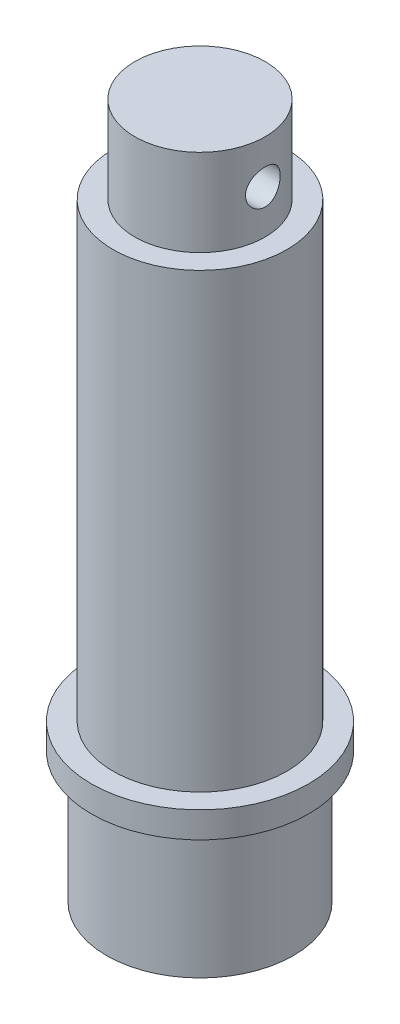
ISO-10303-21;
HEADER;
FILE_DESCRIPTION(('STEP AP214'),'2;1');
FILE_NAME('part.step','',(''),(''),'','','');
FILE_SCHEMA(('AUTOMOTIVE_DESIGN { 1 0 10303 214 1 1 1 1 }'));
ENDSEC;
DATA;
#1=APPLICATION_CONTEXT('core data for automotive mechanical design processes');
#2=APPLICATION_PROTOCOL_DEFINITION('international standard','automotive_design',2000,#1);
#3=PRODUCT_CONTEXT('',#1,'mechanical');
#4=PRODUCT('Part','Part','',(#3));
#5=PRODUCT_RELATED_PRODUCT_CATEGORY('part','',(#4));
#6=PRODUCT_DEFINITION_FORMATION('','',#4);
#7=PRODUCT_DEFINITION_CONTEXT('part definition',#1,'design');
#8=PRODUCT_DEFINITION('design','',#6,#7);
#9=PRODUCT_DEFINITION_SHAPE('','',#8);
#10=(LENGTH_UNIT() NAMED_UNIT(*) SI_UNIT(.MILLI.,.METRE.));
#11=(NAMED_UNIT(*) PLANE_ANGLE_UNIT() SI_UNIT($,.RADIAN.));
#12=(NAMED_UNIT(*) SI_UNIT($,.STERADIAN.) SOLID_ANGLE_UNIT());
#13=UNCERTAINTY_MEASURE_WITH_UNIT(LENGTH_MEASURE(1.E-05),#10,'distance_accuracy_value','');
#14=(GEOMETRIC_REPRESENTATION_CONTEXT(3) GLOBAL_UNCERTAINTY_ASSIGNED_CONTEXT((#13)) GLOBAL_UNIT_ASSIGNED_CONTEXT((#10,
#11,#12)) REPRESENTATION_CONTEXT('',''));
#15=CARTESIAN_POINT('',(0.,0.,0.));
#16=DIRECTION('',(0.,0.,1.));
#17=DIRECTION('',(1.,0.,0.));
#18=AXIS2_PLACEMENT_3D('',#15,#16,#17);
#19=CARTESIAN_POINT('',(-1.56472057533108E-13,54.9999999999999,0.));
#20=DIRECTION('',(0.,-1.,0.));
#21=DIRECTION('',(1.,0.,0.));
#22=AXIS2_PLACEMENT_3D('',#19,#20,#21);
#23=CYLINDRICAL_SURFACE('',#22,10.);
#24=CARTESIAN_POINT('',(0.,-7.00000000000007,0.));
#25=DIRECTION('',(0.,1.,0.));
#26=DIRECTION('',(-1.,0.,0.));
#27=AXIS2_PLACEMENT_3D('',#24,#25,#26);
#28=CIRCLE('',#27,10.);
#29=CARTESIAN_POINT('',(-9.99999999999998,-7.0000000000001,0.));
#30=VERTEX_POINT('',#29);
#31=EDGE_CURVE('E52',#30,#30,#28,.T.);
#32=ORIENTED_EDGE('',*,*,#31,.T.);
#33=EDGE_LOOP('',(#32));
#34=FACE_BOUND('',#33,.T.);
#35=CARTESIAN_POINT('',(-1.28022592527089E-13,45.,0.));
#36=DIRECTION('',(0.,1.,0.));
#37=DIRECTION('',(-1.,0.,0.));
#38=AXIS2_PLACEMENT_3D('',#35,#36,#37);
#39=CIRCLE('',#38,10.);
#40=CARTESIAN_POINT('',(-10.0000000000001,44.9999999999999,0.));
#41=VERTEX_POINT('',#40);
#42=EDGE_CURVE('E11',#41,#41,#39,.T.);
#43=ORIENTED_EDGE('',*,*,#42,.F.);
#44=EDGE_LOOP('',(#43));
#45=FACE_BOUND('',#44,.T.);
#46=ADVANCED_FACE('F48',(#34,#45),#23,.T.);
#47=CARTESIAN_POINT('',(-1.28022592527089E-13,45.,0.));
#48=DIRECTION('',(0.,1.,0.));
#49=DIRECTION('',(-1.,0.,0.));
#50=AXIS2_PLACEMENT_3D('',#47,#48,#49);
#51=CYLINDRICAL_SURFACE('',#50,7.5);
#52=CARTESIAN_POINT('',(7.22841614740034,50.,2.));
#53=CARTESIAN_POINT('',(7.22841805697237,50.1101759377402,1.99999734315871));
#54=CARTESIAN_POINT('',(7.23096264549659,50.220380000476,1.99086493224743));
#55=CARTESIAN_POINT('',(7.24083561155082,50.4376054215563,1.95464583260237));
#56=CARTESIAN_POINT('',(7.24816638907919,50.544625154978,1.92755013620952));
#57=CARTESIAN_POINT('',(7.26672375176824,50.7523080699467,1.85635845560073));
#58=CARTESIAN_POINT('',(7.27794485684189,50.8529799588284,1.81228637542178));
#59=CARTESIAN_POINT('',(7.30301154920387,51.0455167400598,1.70846784563704));
#60=CARTESIAN_POINT('',(7.31685734034409,51.1373809475069,1.6487201784145));
#61=CARTESIAN_POINT('',(7.34600139553452,51.3119925469877,1.51364847874559));
#62=CARTESIAN_POINT('',(7.36132541116428,51.3944870174644,1.43800297504208));
#63=CARTESIAN_POINT('',(7.39147701436492,51.5457815769511,1.27397427284021));
#64=CARTESIAN_POINT('',(7.40630455033424,51.6145802461417,1.18558975534664));
#65=CARTESIAN_POINT('',(7.43407988468404,51.7375849384029,0.996838170873268));
#66=CARTESIAN_POINT('',(7.44699376262278,51.7915395186328,0.896301819879479));
#67=CARTESIAN_POINT('',(7.46919126211819,51.8816846353672,0.68718304472909));
#68=CARTESIAN_POINT('',(7.47847549576247,51.9178781672815,0.578601980875103));
#69=CARTESIAN_POINT('',(7.49218553576447,51.9706552202357,0.359115961810089));
#70=CARTESIAN_POINT('',(7.4967177675025,51.9876689766259,0.248321224200915));
#71=CARTESIAN_POINT('',(7.50078524617735,52.0029571201071,0.025363553508575));
#72=CARTESIAN_POINT('',(7.50032132946593,52.0012346436301,-0.0867991474385301));
#73=CARTESIAN_POINT('',(7.4945267585975,51.9794021874605,-0.306314237111347));
#74=CARTESIAN_POINT('',(7.48931914026984,51.9597570423637,-0.413716600721112));
#75=CARTESIAN_POINT('',(7.47476748590455,51.903387862218,-0.623641315571057));
#76=CARTESIAN_POINT('',(7.46542321400575,51.8666628533139,-0.726163388180582));
#77=CARTESIAN_POINT('',(7.44346569099877,51.7768201524076,-0.924603945147555));
#78=CARTESIAN_POINT('',(7.43082087877657,51.7235431928992,-1.02044668632954));
#79=CARTESIAN_POINT('',(7.40362468509489,51.6022311804909,-1.20198999876452));
#80=CARTESIAN_POINT('',(7.38907293222985,51.5341932509718,-1.28768858808586));
#81=CARTESIAN_POINT('',(7.35911272938704,51.382823142066,-1.44928536946561));
#82=CARTESIAN_POINT('',(7.34369169368724,51.2990855549506,-1.52480192017773));
#83=CARTESIAN_POINT('',(7.31413405023506,51.1199753237611,-1.66081332104769));
#84=CARTESIAN_POINT('',(7.29999752083051,51.0246019707995,-1.72130725529808));
#85=CARTESIAN_POINT('',(7.27455902280762,50.8240998981786,-1.82584679186274));
#86=CARTESIAN_POINT('',(7.26327507092141,50.7189146490868,-1.86978866600526));
#87=CARTESIAN_POINT('',(7.24504325087501,50.502273500545,-1.93924001685674));
#88=CARTESIAN_POINT('',(7.23809430746831,50.3908191635496,-1.96475406461341));
#89=CARTESIAN_POINT('',(7.22954835612961,50.1683727889716,-1.99596757092855));
#90=CARTESIAN_POINT('',(7.22779763213442,50.0574664513786,-2.00223632621177));
#91=CARTESIAN_POINT('',(7.22942578390801,49.8361902271914,-1.9963498112297));
#92=CARTESIAN_POINT('',(7.23280411376424,49.72582028476,-1.98419650172322));
#93=CARTESIAN_POINT('',(7.24416124318851,49.5109434059084,-1.94231271869971));
#94=CARTESIAN_POINT('',(7.25205039699285,49.4063645620627,-1.91292447912922));
#95=CARTESIAN_POINT('',(7.2714526895277,49.20362036864,-1.83778986725474));
#96=CARTESIAN_POINT('',(7.28296630148549,49.1054558585725,-1.79204135876651));
#97=CARTESIAN_POINT('',(7.3086357247297,48.9159450425647,-1.68432905508707));
#98=CARTESIAN_POINT('',(7.3228440487285,48.8247960241102,-1.62203095237924));
#99=CARTESIAN_POINT('',(7.35217841933652,48.6540366982968,-1.48340227987515));
#100=CARTESIAN_POINT('',(7.36730463810224,48.5744285650458,-1.40706907222966));
#101=CARTESIAN_POINT('',(7.39729964884442,48.42664752675,-1.23990378250484));
#102=CARTESIAN_POINT('',(7.41214836523835,48.3588716230214,-1.14871641600884));
#103=CARTESIAN_POINT('',(7.43946670017113,48.2395890125894,-0.955928435940741));
#104=CARTESIAN_POINT('',(7.45193644532891,48.188081439921,-0.854328377018883));
#105=CARTESIAN_POINT('',(7.47301150899247,48.1032703676384,-0.644314134825873));
#106=CARTESIAN_POINT('',(7.48164558480371,48.0698309805565,-0.535957852882338));
#107=CARTESIAN_POINT('',(7.49420303787233,48.0217112719356,-0.31489938473132));
#108=CARTESIAN_POINT('',(7.49812745904966,48.0070267932253,-0.202198167320242));
#109=CARTESIAN_POINT('',(7.50077413437678,47.9970941762585,0.0206420013461514));
#110=CARTESIAN_POINT('',(7.49965226288069,48.0012636808688,0.130753511527865));
#111=CARTESIAN_POINT('',(7.49268490978846,48.0275684935752,0.348648304630718));
#112=CARTESIAN_POINT('',(7.48683960554772,48.049703127117,0.456431674812815));
#113=CARTESIAN_POINT('',(7.47111310390909,48.1109806049185,0.66591012346421));
#114=CARTESIAN_POINT('',(7.46125997189216,48.1500052934724,0.767642011851539));
#115=CARTESIAN_POINT('',(7.4385481651648,48.2438496017462,0.963172098471352));
#116=CARTESIAN_POINT('',(7.42568906899239,48.2986714366128,1.05696918166215));
#117=CARTESIAN_POINT('',(7.39791331224108,48.424258272137,1.23667826867367));
#118=CARTESIAN_POINT('',(7.38295093371621,48.4954093806986,1.32231336173331));
#119=CARTESIAN_POINT('',(7.35284000077242,48.6509027493649,1.48062537156133));
#120=CARTESIAN_POINT('',(7.33769139839707,48.7352484758193,1.55329887243048));
#121=CARTESIAN_POINT('',(7.30853959638842,48.9169683958175,1.68520700232561));
#122=CARTESIAN_POINT('',(7.29456891224632,49.0145883136572,1.74411094261233));
#123=CARTESIAN_POINT('',(7.26981393903458,49.2187063108602,1.84458689030054));
#124=CARTESIAN_POINT('',(7.25902756724933,49.3251985285394,1.88617023367332));
#125=CARTESIAN_POINT('',(7.2433600065386,49.5260813360512,1.94538124252481));
#126=CARTESIAN_POINT('',(7.23780140272181,49.6196012645567,1.96581518399489));
#127=CARTESIAN_POINT('',(7.23032885211556,49.8087405579939,1.9931249429388));
#128=CARTESIAN_POINT('',(7.22841448976002,49.9043596822888,2.0000023063216));
#129=CARTESIAN_POINT('',(7.22841614740034,50.,2.));
#130=B_SPLINE_CURVE_WITH_KNOTS('',3,(#52,#53,#54,#55,#56,#57,#58,#59,#60,#61,#62,#63,#64,#65,
#66,#67,#68,#69,#70,#71,#72,#73,#74,#75,#76,#77,#78,#79,#80,#81,#82,#83,#84,#85,#86,#87,#88,#89,
#90,#91,#92,#93,#94,#95,#96,#97,#98,#99,#100,#101,#102,#103,#104,#105,#106,#107,#108,#109,#110,
#111,#112,#113,#114,#115,#116,#117,#118,#119,#120,#121,#122,#123,#124,#125,#126,#127,#128,#129),
.UNSPECIFIED.,.T.,.F.,(4,2,2,2,2,2,2,2,2,2,2,2,2,2,2,2,2,2,2,2,2,2,2,2,2,2,2,2,2,2,2,2,2,2,2,2,
2,2,4),(0.,0.33017612811603,0.660517947850204,0.99039631159616,1.32030030656104,
1.65765916130211,1.99505297124461,2.33785207370803,2.68059334304246,3.0154830431648,
3.35031668385603,3.67670570800803,4.00311334440696,4.3327644890557,4.66247993394491,
5.00231762300329,5.34217602639579,5.68413015096536,6.02599942418508,6.35765334242024,
6.68927196343503,7.01451850432575,7.33980752864823,7.67224634967772,8.00474771541475,
8.34685906959633,8.68895221008103,9.02843539591401,9.36784331959006,9.69684054916463,
10.0258254261296,10.3525451486866,10.6793107076596,11.0147885399158,11.3503546538105,
11.6933003898558,12.0360213210131,12.3226696767153,12.6092853429065),.UNSPECIFIED.);
#131=CARTESIAN_POINT('',(7.22841614740034,50.,2.));
#132=VERTEX_POINT('',#131);
#133=EDGE_CURVE('E65',#132,#132,#130,.T.);
#134=ORIENTED_EDGE('',*,*,#133,.T.);
#135=EDGE_LOOP('',(#134));
#136=FACE_BOUND('',#135,.T.);
#137=CARTESIAN_POINT('',(-1.28022592527089E-13,45.,0.));
#138=DIRECTION('',(0.,1.,0.));
#139=DIRECTION('',(-1.,0.,0.));
#140=AXIS2_PLACEMENT_3D('',#137,#138,#139);
#141=CIRCLE('',#140,7.5);
#142=CARTESIAN_POINT('',(-7.50000000000013,44.9999999999999,0.));
#143=VERTEX_POINT('',#142);
#144=EDGE_CURVE('E56',#143,#143,#141,.T.);
#145=ORIENTED_EDGE('',*,*,#144,.T.);
#146=EDGE_LOOP('',(#145));
#147=FACE_BOUND('',#146,.T.);
#148=CARTESIAN_POINT('',(-1.56472057533108E-13,54.9999999999999,0.));
#149=DIRECTION('',(0.,1.,0.));
#150=DIRECTION('',(-1.,0.,0.));
#151=AXIS2_PLACEMENT_3D('',#148,#149,#150);
#152=CIRCLE('',#151,7.5);
#153=CARTESIAN_POINT('',(-7.50000000000016,54.9999999999999,0.));
#154=VERTEX_POINT('',#153);
#155=EDGE_CURVE('E61',#154,#154,#152,.T.);
#156=ORIENTED_EDGE('',*,*,#155,.F.);
#157=EDGE_LOOP('',(#156));
#158=FACE_BOUND('',#157,.T.);
#159=CARTESIAN_POINT('',(-7.50000000000014,47.9999999999999,0.));
#160=CARTESIAN_POINT('',(-7.49999833810175,48.0000026169348,-0.110254555832854));
#161=CARTESIAN_POINT('',(-7.49754486162164,48.0091476141896,-0.22053716022184));
#162=CARTESIAN_POINT('',(-7.48799573621673,48.0454212307386,-0.437925451354464));
#163=CARTESIAN_POINT('',(-7.480897853326,48.0725585044261,-0.545029583319087));
#164=CARTESIAN_POINT('',(-7.46284333252804,48.143871666864,-0.752891589045312));
#165=CARTESIAN_POINT('',(-7.45189167130389,48.188025587666,-0.853657451015282));
#166=CARTESIAN_POINT('',(-7.42728699151692,48.2920372426666,-1.04635368639266));
#167=CARTESIAN_POINT('',(-7.41363379295194,48.3518960233592,-1.13828347044962));
#168=CARTESIAN_POINT('',(-7.38474614902008,48.4870835164133,-1.31282950374002));
#169=CARTESIAN_POINT('',(-7.36948467678695,48.5627086680082,-1.39521168986279));
#170=CARTESIAN_POINT('',(-7.33927409679605,48.7266484830633,-1.54628713660638));
#171=CARTESIAN_POINT('',(-7.32432502947257,48.8149647776175,-1.61497863495665));
#172=CARTESIAN_POINT('',(-7.29615537464386,49.0036482348254,-1.73786409243415));
#173=CARTESIAN_POINT('',(-7.28296888563253,49.1041963282617,-1.79178877736488));
#174=CARTESIAN_POINT('',(-7.26021477318201,49.3133401110924,-1.88187548076994));
#175=CARTESIAN_POINT('',(-7.25064648253279,49.4219343123314,-1.91804077451369));
#176=CARTESIAN_POINT('',(-7.23649115802413,49.641495537825,-1.97076920226504));
#177=CARTESIAN_POINT('',(-7.23179647811504,49.7523535399307,-1.98775670244692));
#178=CARTESIAN_POINT('',(-7.22759830916385,49.9754376833065,-2.0029703470582));
#179=CARTESIAN_POINT('',(-7.2280938501446,50.087663565024,-2.00119999705753));
#180=CARTESIAN_POINT('',(-7.23412378802045,50.306985415374,-1.97928510002699));
#181=CARTESIAN_POINT('',(-7.23951735511545,50.4141371820384,-1.95965406064765));
#182=CARTESIAN_POINT('',(-7.25451013080702,50.6235683344562,-1.90339748722183));
#183=CARTESIAN_POINT('',(-7.26410967552627,50.7258473300753,-1.86677059492995));
#184=CARTESIAN_POINT('',(-7.28655661748401,50.9239681438085,-1.77714356965256));
#185=CARTESIAN_POINT('',(-7.29943942818717,51.0197243392862,-1.72396341137784));
#186=CARTESIAN_POINT('',(-7.32698229642459,51.2011341588515,-1.60286503823778));
#187=CARTESIAN_POINT('',(-7.34164270355201,51.2867857891564,-1.53494392224251));
#188=CARTESIAN_POINT('',(-7.37167510629878,51.4484889974548,-1.38366607263419));
#189=CARTESIAN_POINT('',(-7.38705471488845,51.5241363183149,-1.29987812728299));
#190=CARTESIAN_POINT('',(-7.41636381276331,51.6603887803502,-1.12061766820637));
#191=CARTESIAN_POINT('',(-7.43029324488569,51.7209933287024,-1.02514469420509));
#192=CARTESIAN_POINT('',(-7.45521820398308,51.8256179028246,-0.824598255497455));
#193=CARTESIAN_POINT('',(-7.46620072833575,51.8695647704485,-0.719484902551792));
#194=CARTESIAN_POINT('',(-7.48390044401014,51.9390471888133,-0.503002294390397));
#195=CARTESIAN_POINT('',(-7.49061856733764,51.9645867627239,-0.391634411928326));
#196=CARTESIAN_POINT('',(-7.49889158558399,51.9958948769178,-0.169254083145517));
#197=CARTESIAN_POINT('',(-7.50058997470974,52.0022130398508,-0.0583242376413815));
#198=CARTESIAN_POINT('',(-7.4990447169171,51.996416835753,0.163010045901198));
#199=CARTESIAN_POINT('',(-7.49580158080367,51.9843043738942,0.273414537062114));
#200=CARTESIAN_POINT('',(-7.48483035496036,51.94244155254,0.48860244990178));
#201=CARTESIAN_POINT('',(-7.47718026546344,51.9129977538022,0.593449852027782));
#202=CARTESIAN_POINT('',(-7.45826294894154,51.837664055492,0.796706971176064));
#203=CARTESIAN_POINT('',(-7.44699532996176,51.7917723737494,0.895115989216026));
#204=CARTESIAN_POINT('',(-7.42175660559543,51.6838261128194,1.08483847466795));
#205=CARTESIAN_POINT('',(-7.40773686604971,51.6214725332022,1.17597518846118));
#206=CARTESIAN_POINT('',(-7.37861452365578,51.482748369842,1.34668463539714));
#207=CARTESIAN_POINT('',(-7.36351170727535,51.4063750173989,1.42625507879918));
#208=CARTESIAN_POINT('',(-7.33339745866719,51.2392144225054,1.57388924478774));
#209=CARTESIAN_POINT('',(-7.31840061429327,51.1480814386048,1.64156519249816));
#210=CARTESIAN_POINT('',(-7.29066447182742,50.9554353039003,1.76067191185118));
#211=CARTESIAN_POINT('',(-7.27792507956331,50.8539225863776,1.81210336122161));
#212=CARTESIAN_POINT('',(-7.25629268373224,50.6439046929238,1.89687411586112));
#213=CARTESIAN_POINT('',(-7.24737748318023,50.5354441881824,1.93031812253958));
#214=CARTESIAN_POINT('',(-7.23439825126815,50.3141606803252,1.97841205118791));
#215=CARTESIAN_POINT('',(-7.23033298020028,50.201338799652,1.99306677602478));
#216=CARTESIAN_POINT('',(-7.22761744573603,49.9785052121162,2.00288989653714));
#217=CARTESIAN_POINT('',(-7.22879397743253,49.8685226797417,1.99868155618109));
#218=CARTESIAN_POINT('',(-7.23602396081101,49.6508964859899,1.97234376000439));
#219=CARTESIAN_POINT('',(-7.24207728699453,49.5432527644994,1.95021476535025));
#220=CARTESIAN_POINT('',(-7.25827571073172,49.3341442478701,1.88902515699699));
#221=CARTESIAN_POINT('',(-7.26838885019658,49.2326381572678,1.8500966107558));
#222=CARTESIAN_POINT('',(-7.29156818136191,49.0375211694658,1.75651554562386));
#223=CARTESIAN_POINT('',(-7.30463483621378,48.9439115136994,1.70186056024617));
#224=CARTESIAN_POINT('',(-7.33272921440474,48.7642696405033,1.57648909268817));
#225=CARTESIAN_POINT('',(-7.34780333101704,48.6785414650237,1.50534729767909));
#226=CARTESIAN_POINT('',(-7.37795503783021,48.5200375483326,1.349830535111));
#227=CARTESIAN_POINT('',(-7.39303262798455,48.4472649613311,1.26545235435875));
#228=CARTESIAN_POINT('',(-7.42187812403982,48.3152077623531,1.08367998108869));
#229=CARTESIAN_POINT('',(-7.43561111314564,48.2562449893506,0.986045961751778));
#230=CARTESIAN_POINT('',(-7.45983810102911,48.1556625840706,0.781888640416887));
#231=CARTESIAN_POINT('',(-7.47033417683608,48.1140318243363,0.675371094696294));
#232=CARTESIAN_POINT('',(-7.48554752513481,48.0547247145844,0.474374704880988));
#233=CARTESIAN_POINT('',(-7.49092770592616,48.0342506164075,0.380762016565034));
#234=CARTESIAN_POINT('',(-7.4981544903647,48.0068877938329,0.191439795317076));
#235=CARTESIAN_POINT('',(-7.50000144297284,47.9999977277999,0.0957304704048601));
#236=CARTESIAN_POINT('',(-7.50000000000014,47.9999999999999,0.));
#237=B_SPLINE_CURVE_WITH_KNOTS('',3,(#159,#160,#161,#162,#163,#164,#165,#166,#167,#168,#169,
#170,#171,#172,#173,#174,#175,#176,#177,#178,#179,#180,#181,#182,#183,#184,#185,#186,#187,#188,
#189,#190,#191,#192,#193,#194,#195,#196,#197,#198,#199,#200,#201,#202,#203,#204,#205,#206,#207,
#208,#209,#210,#211,#212,#213,#214,#215,#216,#217,#218,#219,#220,#221,#222,#223,#224,#225,#226,
#227,#228,#229,#230,#231,#232,#233,#234,#235,#236),.UNSPECIFIED.,.T.,.F.,(4,2,2,2,2,2,2,2,2,2,2,
2,2,2,2,2,2,2,2,2,2,2,2,2,2,2,2,2,2,2,2,2,2,2,2,2,2,2,4),(0.,0.330412598949569,0.66098424376145,
0.99113055297193,1.32129886708675,1.65834897954967,1.99544244925149,2.33832582523229,
2.68114594129699,3.01622158250469,3.3512346040432,3.67691002045996,4.00261146812939,
4.33198673346498,4.6614268811763,5.00161259812322,5.34181171937597,5.68348809603041,
6.02508977190138,6.35682717524547,6.68853028925351,7.01453535642116,7.34057575775614,
7.6730028600455,8.00549568258886,8.34736496382788,8.68921998024107,9.02906297699387,
9.36881908663982,9.69743342403611,10.0260393052059,10.352107654483,10.67822717123,
11.0139433957139,11.3497412433245,11.692722522809,12.0354832614518,12.3223981899334,
12.6092847796638),.UNSPECIFIED.);
#238=CARTESIAN_POINT('',(-7.50000000000014,47.9999999999999,0.));
#239=VERTEX_POINT('',#238);
#240=EDGE_CURVE('E72',#239,#239,#237,.T.);
#241=ORIENTED_EDGE('',*,*,#240,.T.);
#242=EDGE_LOOP('',(#241));
#243=FACE_BOUND('',#242,.T.);
#244=ADVANCED_FACE('F77',(#136,#147,#158,#243),#51,.T.);
#245=CARTESIAN_POINT('',(-1.28022592527089E-13,45.,0.));
#246=DIRECTION('',(0.,1.,0.));
#247=DIRECTION('',(-1.,0.,0.));
#248=AXIS2_PLACEMENT_3D('',#245,#246,#247);
#249=PLANE('',#248);
#250=ORIENTED_EDGE('',*,*,#144,.F.);
#251=EDGE_LOOP('',(#250));
#252=FACE_BOUND('',#251,.T.);
#253=ORIENTED_EDGE('',*,*,#42,.T.);
#254=EDGE_LOOP('',(#253));
#255=FACE_BOUND('',#254,.T.);
#256=ADVANCED_FACE('F112',(#252,#255),#249,.T.);
#257=CARTESIAN_POINT('',(-1.56472057533108E-13,54.9999999999999,0.));
#258=DIRECTION('',(0.,1.,0.));
#259=DIRECTION('',(-1.,0.,0.));
#260=AXIS2_PLACEMENT_3D('',#257,#258,#259);
#261=PLANE('',#260);
#262=ORIENTED_EDGE('',*,*,#155,.T.);
#263=EDGE_LOOP('',(#262));
#264=FACE_BOUND('',#263,.T.);
#265=ADVANCED_FACE('F85',(#264),#261,.T.);
#266=CARTESIAN_POINT('',(9.99999999999998,50.,0.));
#267=DIRECTION('',(-1.,0.,0.));
#268=DIRECTION('',(0.,0.,1.));
#269=AXIS2_PLACEMENT_3D('',#266,#267,#268);
#270=CYLINDRICAL_SURFACE('',#269,2.);
#271=ORIENTED_EDGE('',*,*,#240,.F.);
#272=EDGE_LOOP('',(#271));
#273=FACE_BOUND('',#272,.T.);
#274=ORIENTED_EDGE('',*,*,#133,.F.);
#275=EDGE_LOOP('',(#274));
#276=FACE_BOUND('',#275,.T.);
#277=ADVANCED_FACE('F80',(#273,#276),#270,.F.);
#278=CARTESIAN_POINT('',(0.,-7.00000000000007,0.));
#279=DIRECTION('',(0.,-1.,0.));
#280=DIRECTION('',(1.,0.,0.));
#281=AXIS2_PLACEMENT_3D('',#278,#279,#280);
#282=CYLINDRICAL_SURFACE('',#281,12.5);
#283=CARTESIAN_POINT('',(0.,-7.00000000000007,0.));
#284=DIRECTION('',(0.,1.,0.));
#285=DIRECTION('',(-1.,0.,0.));
#286=AXIS2_PLACEMENT_3D('',#283,#284,#285);
#287=CIRCLE('',#286,12.5);
#288=CARTESIAN_POINT('',(-12.5,-7.00000000000011,0.));
#289=VERTEX_POINT('',#288);
#290=EDGE_CURVE('E209',#289,#289,#287,.T.);
#291=ORIENTED_EDGE('',*,*,#290,.F.);
#292=EDGE_LOOP('',(#291));
#293=FACE_BOUND('',#292,.T.);
#294=CARTESIAN_POINT('',(0.,-10.0000000000001,0.));
#295=DIRECTION('',(0.,1.,0.));
#296=DIRECTION('',(-1.,0.,0.));
#297=AXIS2_PLACEMENT_3D('',#294,#295,#296);
#298=CIRCLE('',#297,12.5);
#299=CARTESIAN_POINT('',(-12.5,-10.0000000000001,0.));
#300=VERTEX_POINT('',#299);
#301=EDGE_CURVE('E210',#300,#300,#298,.T.);
#302=ORIENTED_EDGE('',*,*,#301,.T.);
#303=EDGE_LOOP('',(#302));
#304=FACE_BOUND('',#303,.T.);
#305=ADVANCED_FACE('F84',(#293,#304),#282,.T.);
#306=CARTESIAN_POINT('',(0.,-7.00000000000007,0.));
#307=DIRECTION('',(0.,1.,0.));
#308=DIRECTION('',(-1.,0.,0.));
#309=AXIS2_PLACEMENT_3D('',#306,#307,#308);
#310=PLANE('',#309);
#311=ORIENTED_EDGE('',*,*,#31,.F.);
#312=EDGE_LOOP('',(#311));
#313=FACE_BOUND('',#312,.T.);
#314=ORIENTED_EDGE('',*,*,#290,.T.);
#315=EDGE_LOOP('',(#314));
#316=FACE_BOUND('',#315,.T.);
#317=ADVANCED_FACE('F94',(#313,#316),#310,.T.);
#318=CARTESIAN_POINT('',(0.,-10.0000000000001,0.));
#319=DIRECTION('',(0.,1.,0.));
#320=DIRECTION('',(-1.,0.,0.));
#321=AXIS2_PLACEMENT_3D('',#318,#319,#320);
#322=PLANE('',#321);
#323=CARTESIAN_POINT('',(0.,-10.0000000000001,0.));
#324=DIRECTION('',(0.,1.,0.));
#325=DIRECTION('',(-1.,0.,0.));
#326=AXIS2_PLACEMENT_3D('',#323,#324,#325);
#327=CIRCLE('',#326,10.75);
#328=CARTESIAN_POINT('',(-10.75,-10.0000000000001,0.));
#329=VERTEX_POINT('',#328);
#330=EDGE_CURVE('E205',#329,#329,#327,.F.);
#331=ORIENTED_EDGE('',*,*,#330,.F.);
#332=EDGE_LOOP('',(#331));
#333=FACE_BOUND('',#332,.T.);
#334=ORIENTED_EDGE('',*,*,#301,.F.);
#335=EDGE_LOOP('',(#334));
#336=FACE_BOUND('',#335,.T.);
#337=ADVANCED_FACE('F96',(#333,#336),#322,.F.);
#338=CARTESIAN_POINT('',(50.,-24.9999999999999,0.));
#339=DIRECTION('',(0.,-1.,0.));
#340=DIRECTION('',(1.,0.,0.));
#341=AXIS2_PLACEMENT_3D('',#338,#339,#340);
#342=PLANE('',#341);
#343=CARTESIAN_POINT('',(0.,-25.0000000000001,0.));
#344=DIRECTION('',(0.,-1.,0.));
#345=DIRECTION('',(1.,0.,0.));
#346=AXIS2_PLACEMENT_3D('',#343,#344,#345);
#347=CIRCLE('',#346,10.75);
#348=CARTESIAN_POINT('',(10.7500000000001,-25.,0.));
#349=VERTEX_POINT('',#348);
#350=EDGE_CURVE('E73',#349,#349,#347,.T.);
#351=ORIENTED_EDGE('',*,*,#350,.T.);
#352=EDGE_LOOP('',(#351));
#353=FACE_BOUND('',#352,.T.);
#354=ADVANCED_FACE('F50',(#353),#342,.T.);
#355=CARTESIAN_POINT('',(0.,-10.0000000000001,0.));
#356=DIRECTION('',(0.,-1.,0.));
#357=DIRECTION('',(1.,0.,0.));
#358=AXIS2_PLACEMENT_3D('',#355,#356,#357);
#359=CYLINDRICAL_SURFACE('',#358,10.75);
#360=ORIENTED_EDGE('',*,*,#330,.T.);
#361=EDGE_LOOP('',(#360));
#362=FACE_BOUND('',#361,.T.);
#363=ORIENTED_EDGE('',*,*,#350,.F.);
#364=EDGE_LOOP('',(#363));
#365=FACE_BOUND('',#364,.T.);
#366=ADVANCED_FACE('F87',(#362,#365),#359,.T.);
#367=CLOSED_SHELL('',(#46,#244,#256,#265,#277,#305,#317,#337,#354,#366));
#368=MANIFOLD_SOLID_BREP('B2',#367);
#369=ADVANCED_BREP_SHAPE_REPRESENTATION('',(#18,#368),#14);
#370=SHAPE_DEFINITION_REPRESENTATION(#9,#369);
ENDSEC;
END-ISO-10303-21;
